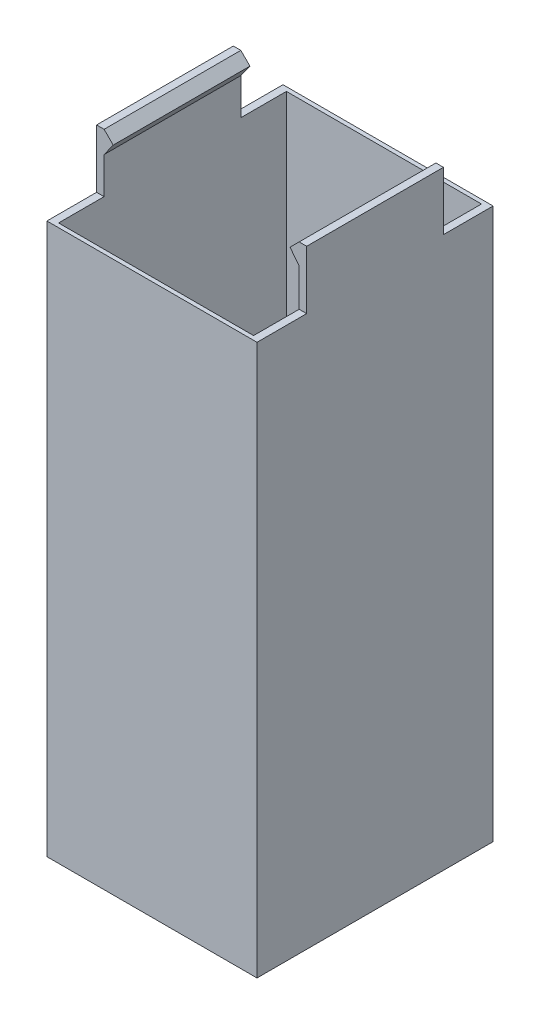
ISO-10303-21;
HEADER;
FILE_DESCRIPTION(('STEP AP214'),'2;1');
FILE_NAME('part.step','',(''),(''),'','','');
FILE_SCHEMA(('AUTOMOTIVE_DESIGN { 1 0 10303 214 1 1 1 1 }'));
ENDSEC;
DATA;
#1=APPLICATION_CONTEXT('core data for automotive mechanical design processes');
#2=APPLICATION_PROTOCOL_DEFINITION('international standard','automotive_design',2000,#1);
#3=PRODUCT_CONTEXT('',#1,'mechanical');
#4=PRODUCT('Part','Part','',(#3));
#5=PRODUCT_RELATED_PRODUCT_CATEGORY('part','',(#4));
#6=PRODUCT_DEFINITION_FORMATION('','',#4);
#7=PRODUCT_DEFINITION_CONTEXT('part definition',#1,'design');
#8=PRODUCT_DEFINITION('design','',#6,#7);
#9=PRODUCT_DEFINITION_SHAPE('','',#8);
#10=(LENGTH_UNIT() NAMED_UNIT(*) SI_UNIT(.MILLI.,.METRE.));
#11=(NAMED_UNIT(*) PLANE_ANGLE_UNIT() SI_UNIT($,.RADIAN.));
#12=(NAMED_UNIT(*) SI_UNIT($,.STERADIAN.) SOLID_ANGLE_UNIT());
#13=UNCERTAINTY_MEASURE_WITH_UNIT(LENGTH_MEASURE(1.E-05),#10,'distance_accuracy_value','');
#14=(GEOMETRIC_REPRESENTATION_CONTEXT(3) GLOBAL_UNCERTAINTY_ASSIGNED_CONTEXT((#13)) GLOBAL_UNIT_ASSIGNED_CONTEXT((#10,
#11,#12)) REPRESENTATION_CONTEXT('',''));
#15=CARTESIAN_POINT('',(0.,0.,0.));
#16=DIRECTION('',(0.,0.,1.));
#17=DIRECTION('',(1.,0.,0.));
#18=AXIS2_PLACEMENT_3D('',#15,#16,#17);
#19=CARTESIAN_POINT('',(0.,120.,0.));
#20=DIRECTION('',(0.,1.,0.));
#21=DIRECTION('',(0.,0.,1.));
#22=AXIS2_PLACEMENT_3D('',#19,#20,#21);
#23=PLANE('',#22);
#24=DIRECTION('',(0.,0.,-1.));
#25=VECTOR('',#24,1.);
#26=CARTESIAN_POINT('',(23.05,120.,-25.9));
#27=LINE('',#26,#25);
#28=CARTESIAN_POINT('',(23.05,120.,25.9));
#29=VERTEX_POINT('',#28);
#30=CARTESIAN_POINT('',(23.05,120.,15.));
#31=VERTEX_POINT('',#30);
#32=EDGE_CURVE('E183',#29,#31,#27,.T.);
#33=ORIENTED_EDGE('',*,*,#32,.T.);
#34=DIRECTION('',(1.,0.,0.));
#35=VECTOR('',#34,1.);
#36=CARTESIAN_POINT('',(21.4,120.,15.));
#37=LINE('',#36,#35);
#38=CARTESIAN_POINT('',(21.4,120.,15.));
#39=VERTEX_POINT('',#38);
#40=EDGE_CURVE('E226',#39,#31,#37,.T.);
#41=ORIENTED_EDGE('',*,*,#40,.F.);
#42=DIRECTION('',(0.,0.,-1.));
#43=VECTOR('',#42,1.);
#44=CARTESIAN_POINT('',(21.4,120.,-25.));
#45=LINE('',#44,#43);
#46=CARTESIAN_POINT('',(21.4,120.,25.));
#47=VERTEX_POINT('',#46);
#48=EDGE_CURVE('E289',#47,#39,#45,.T.);
#49=ORIENTED_EDGE('',*,*,#48,.F.);
#50=DIRECTION('',(1.,0.,0.));
#51=VECTOR('',#50,1.);
#52=CARTESIAN_POINT('',(21.4,120.,25.));
#53=LINE('',#52,#51);
#54=CARTESIAN_POINT('',(-21.4,120.,25.));
#55=VERTEX_POINT('',#54);
#56=EDGE_CURVE('E285',#55,#47,#53,.T.);
#57=ORIENTED_EDGE('',*,*,#56,.F.);
#58=DIRECTION('',(0.,0.,1.));
#59=VECTOR('',#58,1.);
#60=CARTESIAN_POINT('',(-21.4,120.,-25.));
#61=LINE('',#60,#59);
#62=CARTESIAN_POINT('',(-21.4,120.,15.));
#63=VERTEX_POINT('',#62);
#64=EDGE_CURVE('E286',#63,#55,#61,.T.);
#65=ORIENTED_EDGE('',*,*,#64,.F.);
#66=DIRECTION('',(1.,0.,0.));
#67=VECTOR('',#66,1.);
#68=CARTESIAN_POINT('',(-21.4,120.,15.));
#69=LINE('',#68,#67);
#70=CARTESIAN_POINT('',(-23.05,120.,15.));
#71=VERTEX_POINT('',#70);
#72=EDGE_CURVE('E256',#71,#63,#69,.T.);
#73=ORIENTED_EDGE('',*,*,#72,.F.);
#74=DIRECTION('',(0.,0.,1.));
#75=VECTOR('',#74,1.);
#76=CARTESIAN_POINT('',(-23.05,120.,-25.9));
#77=LINE('',#76,#75);
#78=CARTESIAN_POINT('',(-23.05,120.,25.9));
#79=VERTEX_POINT('',#78);
#80=EDGE_CURVE('E318',#71,#79,#77,.T.);
#81=ORIENTED_EDGE('',*,*,#80,.T.);
#82=DIRECTION('',(1.,0.,0.));
#83=VECTOR('',#82,1.);
#84=CARTESIAN_POINT('',(-23.05,120.,25.9));
#85=LINE('',#84,#83);
#86=EDGE_CURVE('E187',#79,#29,#85,.T.);
#87=ORIENTED_EDGE('',*,*,#86,.T.);
#88=EDGE_LOOP('',(#33,#41,#49,#57,#65,#73,#81,#87));
#89=FACE_BOUND('',#88,.T.);
#90=ADVANCED_FACE('F37',(#89),#23,.T.);
#91=CARTESIAN_POINT('',(21.4,120.,-15.));
#92=VERTEX_POINT('',#91);
#93=CARTESIAN_POINT('',(21.4,120.,-25.));
#94=VERTEX_POINT('',#93);
#95=EDGE_CURVE('E288',#92,#94,#45,.T.);
#96=ORIENTED_EDGE('',*,*,#95,.F.);
#97=DIRECTION('',(-1.,0.,0.));
#98=VECTOR('',#97,1.);
#99=CARTESIAN_POINT('',(21.4,120.,-15.));
#100=LINE('',#99,#98);
#101=CARTESIAN_POINT('',(23.05,120.,-15.));
#102=VERTEX_POINT('',#101);
#103=EDGE_CURVE('E240',#102,#92,#100,.T.);
#104=ORIENTED_EDGE('',*,*,#103,.F.);
#105=CARTESIAN_POINT('',(23.05,120.,-25.9));
#106=VERTEX_POINT('',#105);
#107=EDGE_CURVE('E314',#102,#106,#27,.T.);
#108=ORIENTED_EDGE('',*,*,#107,.T.);
#109=DIRECTION('',(-1.,0.,0.));
#110=VECTOR('',#109,1.);
#111=CARTESIAN_POINT('',(-23.05,120.,-25.9));
#112=LINE('',#111,#110);
#113=CARTESIAN_POINT('',(-23.05,120.,-25.9));
#114=VERTEX_POINT('',#113);
#115=EDGE_CURVE('E316',#106,#114,#112,.T.);
#116=ORIENTED_EDGE('',*,*,#115,.T.);
#117=CARTESIAN_POINT('',(-23.05,120.,-15.));
#118=VERTEX_POINT('',#117);
#119=EDGE_CURVE('E319',#114,#118,#77,.T.);
#120=ORIENTED_EDGE('',*,*,#119,.T.);
#121=DIRECTION('',(-1.,0.,0.));
#122=VECTOR('',#121,1.);
#123=CARTESIAN_POINT('',(-21.4,120.,-15.));
#124=LINE('',#123,#122);
#125=CARTESIAN_POINT('',(-21.4,120.,-15.));
#126=VERTEX_POINT('',#125);
#127=EDGE_CURVE('E261',#126,#118,#124,.T.);
#128=ORIENTED_EDGE('',*,*,#127,.F.);
#129=CARTESIAN_POINT('',(-21.4,120.,-25.));
#130=VERTEX_POINT('',#129);
#131=EDGE_CURVE('E282',#130,#126,#61,.T.);
#132=ORIENTED_EDGE('',*,*,#131,.F.);
#133=DIRECTION('',(-1.,0.,0.));
#134=VECTOR('',#133,1.);
#135=CARTESIAN_POINT('',(21.4,120.,-25.));
#136=LINE('',#135,#134);
#137=EDGE_CURVE('E292',#94,#130,#136,.T.);
#138=ORIENTED_EDGE('',*,*,#137,.F.);
#139=EDGE_LOOP('',(#96,#104,#108,#116,#120,#128,#132,#138));
#140=FACE_BOUND('',#139,.T.);
#141=ADVANCED_FACE('F336',(#140),#23,.T.);
#142=CARTESIAN_POINT('',(23.05,120.,-25.9));
#143=DIRECTION('',(-1.,0.,0.));
#144=DIRECTION('',(0.,0.,1.));
#145=AXIS2_PLACEMENT_3D('',#142,#143,#144);
#146=PLANE('',#145);
#147=DIRECTION('',(0.,-1.,0.));
#148=VECTOR('',#147,1.);
#149=CARTESIAN_POINT('',(23.05,120.,25.9));
#150=LINE('',#149,#148);
#151=CARTESIAN_POINT('',(23.05,-0.8,25.9));
#152=VERTEX_POINT('',#151);
#153=EDGE_CURVE('E176',#29,#152,#150,.T.);
#154=ORIENTED_EDGE('',*,*,#153,.T.);
#155=DIRECTION('',(0.,0.,1.));
#156=VECTOR('',#155,1.);
#157=CARTESIAN_POINT('',(23.05,-0.8,25.9));
#158=LINE('',#157,#156);
#159=CARTESIAN_POINT('',(23.05,-0.8,-25.9));
#160=VERTEX_POINT('',#159);
#161=EDGE_CURVE('E180',#160,#152,#158,.T.);
#162=ORIENTED_EDGE('',*,*,#161,.F.);
#163=DIRECTION('',(0.,-1.,0.));
#164=VECTOR('',#163,1.);
#165=CARTESIAN_POINT('',(23.05,120.,-25.9));
#166=LINE('',#165,#164);
#167=EDGE_CURVE('E11',#106,#160,#166,.T.);
#168=ORIENTED_EDGE('',*,*,#167,.F.);
#169=ORIENTED_EDGE('',*,*,#107,.F.);
#170=DIRECTION('',(0.,-1.,0.));
#171=VECTOR('',#170,1.);
#172=CARTESIAN_POINT('',(23.05,132.8,-15.));
#173=LINE('',#172,#171);
#174=CARTESIAN_POINT('',(23.05,132.8,-15.));
#175=VERTEX_POINT('',#174);
#176=EDGE_CURVE('E250',#175,#102,#173,.T.);
#177=ORIENTED_EDGE('',*,*,#176,.F.);
#178=DIRECTION('',(0.,0.,-1.));
#179=VECTOR('',#178,1.);
#180=CARTESIAN_POINT('',(23.05,132.8,15.));
#181=LINE('',#180,#179);
#182=CARTESIAN_POINT('',(23.05,132.8,15.));
#183=VERTEX_POINT('',#182);
#184=EDGE_CURVE('E242',#183,#175,#181,.T.);
#185=ORIENTED_EDGE('',*,*,#184,.F.);
#186=DIRECTION('',(0.,-1.,0.));
#187=VECTOR('',#186,1.);
#188=CARTESIAN_POINT('',(23.05,132.8,15.));
#189=LINE('',#188,#187);
#190=EDGE_CURVE('E252',#183,#31,#189,.T.);
#191=ORIENTED_EDGE('',*,*,#190,.T.);
#192=ORIENTED_EDGE('',*,*,#32,.F.);
#193=EDGE_LOOP('',(#154,#162,#168,#169,#177,#185,#191,#192));
#194=FACE_BOUND('',#193,.T.);
#195=ADVANCED_FACE('F39',(#194),#146,.F.);
#196=CARTESIAN_POINT('',(-23.05,120.,-25.9));
#197=DIRECTION('',(0.,0.,1.));
#198=DIRECTION('',(1.,0.,0.));
#199=AXIS2_PLACEMENT_3D('',#196,#197,#198);
#200=PLANE('',#199);
#201=ORIENTED_EDGE('',*,*,#167,.T.);
#202=DIRECTION('',(1.,0.,0.));
#203=VECTOR('',#202,1.);
#204=CARTESIAN_POINT('',(23.05,-0.8,-25.9));
#205=LINE('',#204,#203);
#206=CARTESIAN_POINT('',(-23.05,-0.8,-25.9));
#207=VERTEX_POINT('',#206);
#208=EDGE_CURVE('E201',#207,#160,#205,.T.);
#209=ORIENTED_EDGE('',*,*,#208,.F.);
#210=DIRECTION('',(0.,-1.,0.));
#211=VECTOR('',#210,1.);
#212=CARTESIAN_POINT('',(-23.05,120.,-25.9));
#213=LINE('',#212,#211);
#214=EDGE_CURVE('E45',#114,#207,#213,.T.);
#215=ORIENTED_EDGE('',*,*,#214,.F.);
#216=ORIENTED_EDGE('',*,*,#115,.F.);
#217=EDGE_LOOP('',(#201,#209,#215,#216));
#218=FACE_BOUND('',#217,.T.);
#219=ADVANCED_FACE('F328',(#218),#200,.F.);
#220=CARTESIAN_POINT('',(-23.05,120.,-25.9));
#221=DIRECTION('',(1.,0.,0.));
#222=DIRECTION('',(0.,0.,-1.));
#223=AXIS2_PLACEMENT_3D('',#220,#221,#222);
#224=PLANE('',#223);
#225=ORIENTED_EDGE('',*,*,#214,.T.);
#226=DIRECTION('',(0.,0.,-1.));
#227=VECTOR('',#226,1.);
#228=CARTESIAN_POINT('',(-23.05,-0.8,25.9));
#229=LINE('',#228,#227);
#230=CARTESIAN_POINT('',(-23.05,-0.8,25.9));
#231=VERTEX_POINT('',#230);
#232=EDGE_CURVE('E196',#231,#207,#229,.T.);
#233=ORIENTED_EDGE('',*,*,#232,.F.);
#234=DIRECTION('',(0.,-1.,0.));
#235=VECTOR('',#234,1.);
#236=CARTESIAN_POINT('',(-23.05,120.,25.9));
#237=LINE('',#236,#235);
#238=EDGE_CURVE('E186',#79,#231,#237,.T.);
#239=ORIENTED_EDGE('',*,*,#238,.F.);
#240=ORIENTED_EDGE('',*,*,#80,.F.);
#241=DIRECTION('',(0.,-1.,0.));
#242=VECTOR('',#241,1.);
#243=CARTESIAN_POINT('',(-23.05,132.8,15.));
#244=LINE('',#243,#242);
#245=CARTESIAN_POINT('',(-23.05,132.8,15.));
#246=VERTEX_POINT('',#245);
#247=EDGE_CURVE('E278',#246,#71,#244,.T.);
#248=ORIENTED_EDGE('',*,*,#247,.F.);
#249=DIRECTION('',(0.,0.,1.));
#250=VECTOR('',#249,1.);
#251=CARTESIAN_POINT('',(-23.05,132.8,15.));
#252=LINE('',#251,#250);
#253=CARTESIAN_POINT('',(-23.05,132.8,-15.));
#254=VERTEX_POINT('',#253);
#255=EDGE_CURVE('E257',#254,#246,#252,.T.);
#256=ORIENTED_EDGE('',*,*,#255,.F.);
#257=DIRECTION('',(0.,-1.,0.));
#258=VECTOR('',#257,1.);
#259=CARTESIAN_POINT('',(-23.05,132.8,-15.));
#260=LINE('',#259,#258);
#261=EDGE_CURVE('E269',#254,#118,#260,.T.);
#262=ORIENTED_EDGE('',*,*,#261,.T.);
#263=ORIENTED_EDGE('',*,*,#119,.F.);
#264=EDGE_LOOP('',(#225,#233,#239,#240,#248,#256,#262,#263));
#265=FACE_BOUND('',#264,.T.);
#266=ADVANCED_FACE('F325',(#265),#224,.F.);
#267=CARTESIAN_POINT('',(-23.05,120.,25.9));
#268=DIRECTION('',(0.,0.,-1.));
#269=DIRECTION('',(-1.,0.,0.));
#270=AXIS2_PLACEMENT_3D('',#267,#268,#269);
#271=PLANE('',#270);
#272=ORIENTED_EDGE('',*,*,#238,.T.);
#273=DIRECTION('',(-1.,0.,0.));
#274=VECTOR('',#273,1.);
#275=CARTESIAN_POINT('',(23.05,-0.8,25.9));
#276=LINE('',#275,#274);
#277=EDGE_CURVE('E190',#152,#231,#276,.T.);
#278=ORIENTED_EDGE('',*,*,#277,.F.);
#279=ORIENTED_EDGE('',*,*,#153,.F.);
#280=ORIENTED_EDGE('',*,*,#86,.F.);
#281=EDGE_LOOP('',(#272,#278,#279,#280));
#282=FACE_BOUND('',#281,.T.);
#283=ADVANCED_FACE('F191',(#282),#271,.F.);
#284=CARTESIAN_POINT('',(-21.4,120.,-25.));
#285=DIRECTION('',(1.,0.,0.));
#286=DIRECTION('',(0.,0.,-1.));
#287=AXIS2_PLACEMENT_3D('',#284,#285,#286);
#288=PLANE('',#287);
#289=DIRECTION('',(0.,0.,1.));
#290=VECTOR('',#289,1.);
#291=CARTESIAN_POINT('',(-21.4,128.,-20.2));
#292=LINE('',#291,#290);
#293=CARTESIAN_POINT('',(-21.4,128.,-15.));
#294=VERTEX_POINT('',#293);
#295=CARTESIAN_POINT('',(-21.4,128.,15.));
#296=VERTEX_POINT('',#295);
#297=EDGE_CURVE('E232',#294,#296,#292,.T.);
#298=ORIENTED_EDGE('',*,*,#297,.T.);
#299=DIRECTION('',(0.,-1.,0.));
#300=VECTOR('',#299,1.);
#301=CARTESIAN_POINT('',(-21.4,132.8,15.));
#302=LINE('',#301,#300);
#303=EDGE_CURVE('E276',#296,#63,#302,.T.);
#304=ORIENTED_EDGE('',*,*,#303,.T.);
#305=ORIENTED_EDGE('',*,*,#64,.T.);
#306=DIRECTION('',(0.,-1.,0.));
#307=VECTOR('',#306,1.);
#308=CARTESIAN_POINT('',(-21.4,120.,25.));
#309=LINE('',#308,#307);
#310=CARTESIAN_POINT('',(-21.4,0.,25.));
#311=VERTEX_POINT('',#310);
#312=EDGE_CURVE('E311',#55,#311,#309,.T.);
#313=ORIENTED_EDGE('',*,*,#312,.T.);
#314=DIRECTION('',(0.,0.,1.));
#315=VECTOR('',#314,1.);
#316=CARTESIAN_POINT('',(-21.4,0.,-25.));
#317=LINE('',#316,#315);
#318=CARTESIAN_POINT('',(-21.4,0.,-25.));
#319=VERTEX_POINT('',#318);
#320=EDGE_CURVE('E281',#319,#311,#317,.T.);
#321=ORIENTED_EDGE('',*,*,#320,.F.);
#322=DIRECTION('',(0.,-1.,0.));
#323=VECTOR('',#322,1.);
#324=CARTESIAN_POINT('',(-21.4,120.,-25.));
#325=LINE('',#324,#323);
#326=EDGE_CURVE('E294',#130,#319,#325,.T.);
#327=ORIENTED_EDGE('',*,*,#326,.F.);
#328=ORIENTED_EDGE('',*,*,#131,.T.);
#329=DIRECTION('',(0.,-1.,0.));
#330=VECTOR('',#329,1.);
#331=CARTESIAN_POINT('',(-21.4,132.8,-15.));
#332=LINE('',#331,#330);
#333=EDGE_CURVE('E60',#294,#126,#332,.T.);
#334=ORIENTED_EDGE('',*,*,#333,.F.);
#335=EDGE_LOOP('',(#298,#304,#305,#313,#321,#327,#328,#334));
#336=FACE_BOUND('',#335,.T.);
#337=ADVANCED_FACE('F366',(#336),#288,.T.);
#338=CARTESIAN_POINT('',(21.4,120.,25.));
#339=DIRECTION('',(0.,0.,-1.));
#340=DIRECTION('',(-1.,0.,0.));
#341=AXIS2_PLACEMENT_3D('',#338,#339,#340);
#342=PLANE('',#341);
#343=DIRECTION('',(1.,0.,0.));
#344=VECTOR('',#343,1.);
#345=CARTESIAN_POINT('',(21.4,0.,25.));
#346=LINE('',#345,#344);
#347=CARTESIAN_POINT('',(21.4,0.,25.));
#348=VERTEX_POINT('',#347);
#349=EDGE_CURVE('E297',#311,#348,#346,.T.);
#350=ORIENTED_EDGE('',*,*,#349,.F.);
#351=ORIENTED_EDGE('',*,*,#312,.F.);
#352=ORIENTED_EDGE('',*,*,#56,.T.);
#353=DIRECTION('',(0.,-1.,0.));
#354=VECTOR('',#353,1.);
#355=CARTESIAN_POINT('',(21.4,120.,25.));
#356=LINE('',#355,#354);
#357=EDGE_CURVE('E309',#47,#348,#356,.T.);
#358=ORIENTED_EDGE('',*,*,#357,.T.);
#359=EDGE_LOOP('',(#350,#351,#352,#358));
#360=FACE_BOUND('',#359,.T.);
#361=ADVANCED_FACE('F379',(#360),#342,.T.);
#362=CARTESIAN_POINT('',(21.4,120.,-25.));
#363=DIRECTION('',(-1.,0.,0.));
#364=DIRECTION('',(0.,0.,1.));
#365=AXIS2_PLACEMENT_3D('',#362,#363,#364);
#366=PLANE('',#365);
#367=DIRECTION('',(0.,0.,1.));
#368=VECTOR('',#367,1.);
#369=CARTESIAN_POINT('',(21.4,128.2,-20.2));
#370=LINE('',#369,#368);
#371=CARTESIAN_POINT('',(21.4,128.2,-15.));
#372=VERTEX_POINT('',#371);
#373=CARTESIAN_POINT('',(21.4,128.2,15.));
#374=VERTEX_POINT('',#373);
#375=EDGE_CURVE('E210',#372,#374,#370,.T.);
#376=ORIENTED_EDGE('',*,*,#375,.F.);
#377=DIRECTION('',(0.,-1.,0.));
#378=VECTOR('',#377,1.);
#379=CARTESIAN_POINT('',(21.4,132.8,-15.));
#380=LINE('',#379,#378);
#381=EDGE_CURVE('E52',#372,#92,#380,.T.);
#382=ORIENTED_EDGE('',*,*,#381,.T.);
#383=ORIENTED_EDGE('',*,*,#95,.T.);
#384=DIRECTION('',(0.,-1.,0.));
#385=VECTOR('',#384,1.);
#386=CARTESIAN_POINT('',(21.4,120.,-25.));
#387=LINE('',#386,#385);
#388=CARTESIAN_POINT('',(21.4,0.,-25.));
#389=VERTEX_POINT('',#388);
#390=EDGE_CURVE('E307',#94,#389,#387,.T.);
#391=ORIENTED_EDGE('',*,*,#390,.T.);
#392=DIRECTION('',(0.,0.,-1.));
#393=VECTOR('',#392,1.);
#394=CARTESIAN_POINT('',(21.4,0.,-25.));
#395=LINE('',#394,#393);
#396=EDGE_CURVE('E300',#348,#389,#395,.T.);
#397=ORIENTED_EDGE('',*,*,#396,.F.);
#398=ORIENTED_EDGE('',*,*,#357,.F.);
#399=ORIENTED_EDGE('',*,*,#48,.T.);
#400=DIRECTION('',(0.,-1.,0.));
#401=VECTOR('',#400,1.);
#402=CARTESIAN_POINT('',(21.4,132.8,15.));
#403=LINE('',#402,#401);
#404=EDGE_CURVE('E254',#374,#39,#403,.T.);
#405=ORIENTED_EDGE('',*,*,#404,.F.);
#406=EDGE_LOOP('',(#376,#382,#383,#391,#397,#398,#399,#405));
#407=FACE_BOUND('',#406,.T.);
#408=ADVANCED_FACE('F373',(#407),#366,.T.);
#409=CARTESIAN_POINT('',(21.4,120.,-25.));
#410=DIRECTION('',(0.,0.,1.));
#411=DIRECTION('',(1.,0.,0.));
#412=AXIS2_PLACEMENT_3D('',#409,#410,#411);
#413=PLANE('',#412);
#414=DIRECTION('',(-1.,0.,0.));
#415=VECTOR('',#414,1.);
#416=CARTESIAN_POINT('',(21.4,0.,-25.));
#417=LINE('',#416,#415);
#418=EDGE_CURVE('E303',#389,#319,#417,.T.);
#419=ORIENTED_EDGE('',*,*,#418,.F.);
#420=ORIENTED_EDGE('',*,*,#390,.F.);
#421=ORIENTED_EDGE('',*,*,#137,.T.);
#422=ORIENTED_EDGE('',*,*,#326,.T.);
#423=EDGE_LOOP('',(#419,#420,#421,#422));
#424=FACE_BOUND('',#423,.T.);
#425=ADVANCED_FACE('F370',(#424),#413,.T.);
#426=CARTESIAN_POINT('',(-21.4,132.8,15.));
#427=DIRECTION('',(0.,0.,-1.));
#428=DIRECTION('',(-1.,0.,0.));
#429=AXIS2_PLACEMENT_3D('',#426,#427,#428);
#430=PLANE('',#429);
#431=ORIENTED_EDGE('',*,*,#72,.T.);
#432=ORIENTED_EDGE('',*,*,#303,.F.);
#433=DIRECTION('',(0.581238193719097,0.813733471206735,0.));
#434=VECTOR('',#433,1.);
#435=CARTESIAN_POINT('',(-19.4,130.8,15.));
#436=LINE('',#435,#434);
#437=CARTESIAN_POINT('',(-19.4,130.8,15.));
#438=VERTEX_POINT('',#437);
#439=EDGE_CURVE('E229',#296,#438,#436,.T.);
#440=ORIENTED_EDGE('',*,*,#439,.T.);
#441=DIRECTION('',(-0.707106781186547,0.707106781186548,0.));
#442=VECTOR('',#441,1.);
#443=CARTESIAN_POINT('',(-21.4,132.8,15.));
#444=LINE('',#443,#442);
#445=CARTESIAN_POINT('',(-21.4,132.8,15.));
#446=VERTEX_POINT('',#445);
#447=EDGE_CURVE('E220',#438,#446,#444,.T.);
#448=ORIENTED_EDGE('',*,*,#447,.T.);
#449=DIRECTION('',(1.,0.,0.));
#450=VECTOR('',#449,1.);
#451=CARTESIAN_POINT('',(-21.4,132.8,15.));
#452=LINE('',#451,#450);
#453=EDGE_CURVE('E260',#246,#446,#452,.T.);
#454=ORIENTED_EDGE('',*,*,#453,.F.);
#455=ORIENTED_EDGE('',*,*,#247,.T.);
#456=EDGE_LOOP('',(#431,#432,#440,#448,#454,#455));
#457=FACE_BOUND('',#456,.T.);
#458=ADVANCED_FACE('F355',(#457),#430,.F.);
#459=CARTESIAN_POINT('',(-21.4,132.8,-15.));
#460=DIRECTION('',(0.,0.,1.));
#461=DIRECTION('',(1.,0.,0.));
#462=AXIS2_PLACEMENT_3D('',#459,#460,#461);
#463=PLANE('',#462);
#464=ORIENTED_EDGE('',*,*,#127,.T.);
#465=ORIENTED_EDGE('',*,*,#261,.F.);
#466=DIRECTION('',(-1.,0.,0.));
#467=VECTOR('',#466,1.);
#468=CARTESIAN_POINT('',(-21.4,132.8,-15.));
#469=LINE('',#468,#467);
#470=CARTESIAN_POINT('',(-21.4,132.8,-15.));
#471=VERTEX_POINT('',#470);
#472=EDGE_CURVE('E267',#471,#254,#469,.T.);
#473=ORIENTED_EDGE('',*,*,#472,.F.);
#474=DIRECTION('',(0.707106781186547,-0.707106781186548,0.));
#475=VECTOR('',#474,1.);
#476=CARTESIAN_POINT('',(-21.4,132.8,-15.));
#477=LINE('',#476,#475);
#478=CARTESIAN_POINT('',(-19.4,130.8,-15.));
#479=VERTEX_POINT('',#478);
#480=EDGE_CURVE('E223',#471,#479,#477,.T.);
#481=ORIENTED_EDGE('',*,*,#480,.T.);
#482=DIRECTION('',(-0.581238193719097,-0.813733471206735,0.));
#483=VECTOR('',#482,1.);
#484=CARTESIAN_POINT('',(-19.4,130.8,-15.));
#485=LINE('',#484,#483);
#486=EDGE_CURVE('E221',#479,#294,#485,.T.);
#487=ORIENTED_EDGE('',*,*,#486,.T.);
#488=ORIENTED_EDGE('',*,*,#333,.T.);
#489=EDGE_LOOP('',(#464,#465,#473,#481,#487,#488));
#490=FACE_BOUND('',#489,.T.);
#491=ADVANCED_FACE('F362',(#490),#463,.F.);
#492=CARTESIAN_POINT('',(0.,132.8,0.));
#493=DIRECTION('',(0.,1.,0.));
#494=DIRECTION('',(0.,0.,1.));
#495=AXIS2_PLACEMENT_3D('',#492,#493,#494);
#496=PLANE('',#495);
#497=ORIENTED_EDGE('',*,*,#255,.T.);
#498=ORIENTED_EDGE('',*,*,#453,.T.);
#499=DIRECTION('',(0.,0.,-1.));
#500=VECTOR('',#499,1.);
#501=CARTESIAN_POINT('',(-21.4,132.8,15.));
#502=LINE('',#501,#500);
#503=EDGE_CURVE('E264',#446,#471,#502,.T.);
#504=ORIENTED_EDGE('',*,*,#503,.T.);
#505=ORIENTED_EDGE('',*,*,#472,.T.);
#506=EDGE_LOOP('',(#497,#498,#504,#505));
#507=FACE_BOUND('',#506,.T.);
#508=ADVANCED_FACE('F359',(#507),#496,.T.);
#509=CARTESIAN_POINT('',(21.4,132.8,15.));
#510=DIRECTION('',(0.,0.,-1.));
#511=DIRECTION('',(-1.,0.,0.));
#512=AXIS2_PLACEMENT_3D('',#509,#510,#511);
#513=PLANE('',#512);
#514=ORIENTED_EDGE('',*,*,#40,.T.);
#515=ORIENTED_EDGE('',*,*,#190,.F.);
#516=DIRECTION('',(1.,0.,0.));
#517=VECTOR('',#516,1.);
#518=CARTESIAN_POINT('',(21.4,132.8,15.));
#519=LINE('',#518,#517);
#520=CARTESIAN_POINT('',(21.4,132.8,15.));
#521=VERTEX_POINT('',#520);
#522=EDGE_CURVE('E239',#521,#183,#519,.T.);
#523=ORIENTED_EDGE('',*,*,#522,.F.);
#524=DIRECTION('',(-0.707106781186548,-0.707106781186547,0.));
#525=VECTOR('',#524,1.);
#526=CARTESIAN_POINT('',(21.4,132.8,15.));
#527=LINE('',#526,#525);
#528=CARTESIAN_POINT('',(19.4,130.8,15.));
#529=VERTEX_POINT('',#528);
#530=EDGE_CURVE('E206',#521,#529,#527,.T.);
#531=ORIENTED_EDGE('',*,*,#530,.T.);
#532=DIRECTION('',(0.609710760849694,-0.792623989104599,0.));
#533=VECTOR('',#532,1.);
#534=CARTESIAN_POINT('',(19.4,130.8,15.));
#535=LINE('',#534,#533);
#536=EDGE_CURVE('E213',#529,#374,#535,.T.);
#537=ORIENTED_EDGE('',*,*,#536,.T.);
#538=ORIENTED_EDGE('',*,*,#404,.T.);
#539=EDGE_LOOP('',(#514,#515,#523,#531,#537,#538));
#540=FACE_BOUND('',#539,.T.);
#541=ADVANCED_FACE('F382',(#540),#513,.F.);
#542=CARTESIAN_POINT('',(21.4,132.8,-15.));
#543=DIRECTION('',(0.,0.,1.));
#544=DIRECTION('',(1.,0.,0.));
#545=AXIS2_PLACEMENT_3D('',#542,#543,#544);
#546=PLANE('',#545);
#547=ORIENTED_EDGE('',*,*,#103,.T.);
#548=ORIENTED_EDGE('',*,*,#381,.F.);
#549=DIRECTION('',(-0.609710760849694,0.792623989104599,0.));
#550=VECTOR('',#549,1.);
#551=CARTESIAN_POINT('',(19.4,130.8,-15.));
#552=LINE('',#551,#550);
#553=CARTESIAN_POINT('',(19.4,130.8,-15.));
#554=VERTEX_POINT('',#553);
#555=EDGE_CURVE('E209',#372,#554,#552,.T.);
#556=ORIENTED_EDGE('',*,*,#555,.T.);
#557=DIRECTION('',(0.707106781186548,0.707106781186547,0.));
#558=VECTOR('',#557,1.);
#559=CARTESIAN_POINT('',(21.4,132.8,-15.));
#560=LINE('',#559,#558);
#561=CARTESIAN_POINT('',(21.4,132.8,-15.));
#562=VERTEX_POINT('',#561);
#563=EDGE_CURVE('E207',#554,#562,#560,.T.);
#564=ORIENTED_EDGE('',*,*,#563,.T.);
#565=DIRECTION('',(-1.,0.,0.));
#566=VECTOR('',#565,1.);
#567=CARTESIAN_POINT('',(21.4,132.8,-15.));
#568=LINE('',#567,#566);
#569=EDGE_CURVE('E244',#175,#562,#568,.T.);
#570=ORIENTED_EDGE('',*,*,#569,.F.);
#571=ORIENTED_EDGE('',*,*,#176,.T.);
#572=EDGE_LOOP('',(#547,#548,#556,#564,#570,#571));
#573=FACE_BOUND('',#572,.T.);
#574=ADVANCED_FACE('F339',(#573),#546,.F.);
#575=CARTESIAN_POINT('',(0.,132.8,0.));
#576=DIRECTION('',(0.,-1.,0.));
#577=DIRECTION('',(0.,0.,-1.));
#578=AXIS2_PLACEMENT_3D('',#575,#576,#577);
#579=PLANE('',#578);
#580=DIRECTION('',(0.,0.,1.));
#581=VECTOR('',#580,1.);
#582=CARTESIAN_POINT('',(21.4,132.8,15.));
#583=LINE('',#582,#581);
#584=EDGE_CURVE('E236',#562,#521,#583,.T.);
#585=ORIENTED_EDGE('',*,*,#584,.T.);
#586=ORIENTED_EDGE('',*,*,#522,.T.);
#587=ORIENTED_EDGE('',*,*,#184,.T.);
#588=ORIENTED_EDGE('',*,*,#569,.T.);
#589=EDGE_LOOP('',(#585,#586,#587,#588));
#590=FACE_BOUND('',#589,.T.);
#591=ADVANCED_FACE('F343',(#590),#579,.F.);
#592=CARTESIAN_POINT('',(-21.4,132.8,-20.2));
#593=DIRECTION('',(0.707106781186548,0.707106781186547,0.));
#594=DIRECTION('',(-0.707106781186547,0.707106781186548,0.));
#595=AXIS2_PLACEMENT_3D('',#592,#593,#594);
#596=PLANE('',#595);
#597=ORIENTED_EDGE('',*,*,#480,.F.);
#598=ORIENTED_EDGE('',*,*,#503,.F.);
#599=ORIENTED_EDGE('',*,*,#447,.F.);
#600=DIRECTION('',(0.,0.,1.));
#601=VECTOR('',#600,1.);
#602=CARTESIAN_POINT('',(-19.4,130.8,-20.2));
#603=LINE('',#602,#601);
#604=EDGE_CURVE('E224',#479,#438,#603,.T.);
#605=ORIENTED_EDGE('',*,*,#604,.F.);
#606=EDGE_LOOP('',(#597,#598,#599,#605));
#607=FACE_BOUND('',#606,.T.);
#608=ADVANCED_FACE('F397',(#607),#596,.T.);
#609=CARTESIAN_POINT('',(-19.4,130.8,-20.2));
#610=DIRECTION('',(0.813733471206735,-0.581238193719097,0.));
#611=DIRECTION('',(0.581238193719097,0.813733471206735,0.));
#612=AXIS2_PLACEMENT_3D('',#609,#610,#611);
#613=PLANE('',#612);
#614=ORIENTED_EDGE('',*,*,#486,.F.);
#615=ORIENTED_EDGE('',*,*,#604,.T.);
#616=ORIENTED_EDGE('',*,*,#439,.F.);
#617=ORIENTED_EDGE('',*,*,#297,.F.);
#618=EDGE_LOOP('',(#614,#615,#616,#617));
#619=FACE_BOUND('',#618,.T.);
#620=ADVANCED_FACE('F390',(#619),#613,.T.);
#621=CARTESIAN_POINT('',(21.4,132.8,-20.2));
#622=DIRECTION('',(-0.707106781186547,0.707106781186548,0.));
#623=DIRECTION('',(-0.707106781186548,-0.707106781186547,0.));
#624=AXIS2_PLACEMENT_3D('',#621,#622,#623);
#625=PLANE('',#624);
#626=ORIENTED_EDGE('',*,*,#563,.F.);
#627=DIRECTION('',(0.,0.,1.));
#628=VECTOR('',#627,1.);
#629=CARTESIAN_POINT('',(19.4,130.8,-20.2));
#630=LINE('',#629,#628);
#631=EDGE_CURVE('E216',#554,#529,#630,.T.);
#632=ORIENTED_EDGE('',*,*,#631,.T.);
#633=ORIENTED_EDGE('',*,*,#530,.F.);
#634=ORIENTED_EDGE('',*,*,#584,.F.);
#635=EDGE_LOOP('',(#626,#632,#633,#634));
#636=FACE_BOUND('',#635,.T.);
#637=ADVANCED_FACE('F388',(#636),#625,.T.);
#638=CARTESIAN_POINT('',(19.4,130.8,-20.2));
#639=DIRECTION('',(-0.792623989104599,-0.609710760849694,0.));
#640=DIRECTION('',(0.609710760849694,-0.792623989104599,0.));
#641=AXIS2_PLACEMENT_3D('',#638,#639,#640);
#642=PLANE('',#641);
#643=ORIENTED_EDGE('',*,*,#555,.F.);
#644=ORIENTED_EDGE('',*,*,#375,.T.);
#645=ORIENTED_EDGE('',*,*,#536,.F.);
#646=ORIENTED_EDGE('',*,*,#631,.F.);
#647=EDGE_LOOP('',(#643,#644,#645,#646));
#648=FACE_BOUND('',#647,.T.);
#649=ADVANCED_FACE('F386',(#648),#642,.T.);
#650=CARTESIAN_POINT('',(0.,0.,0.));
#651=DIRECTION('',(0.,1.,0.));
#652=DIRECTION('',(0.,0.,1.));
#653=AXIS2_PLACEMENT_3D('',#650,#651,#652);
#654=PLANE('',#653);
#655=ORIENTED_EDGE('',*,*,#418,.T.);
#656=ORIENTED_EDGE('',*,*,#320,.T.);
#657=ORIENTED_EDGE('',*,*,#349,.T.);
#658=ORIENTED_EDGE('',*,*,#396,.T.);
#659=EDGE_LOOP('',(#655,#656,#657,#658));
#660=FACE_BOUND('',#659,.T.);
#661=ADVANCED_FACE('F376',(#660),#654,.T.);
#662=CARTESIAN_POINT('',(0.,-0.8,0.));
#663=DIRECTION('',(0.,1.,0.));
#664=DIRECTION('',(0.,0.,1.));
#665=AXIS2_PLACEMENT_3D('',#662,#663,#664);
#666=PLANE('',#665);
#667=ORIENTED_EDGE('',*,*,#161,.T.);
#668=ORIENTED_EDGE('',*,*,#277,.T.);
#669=ORIENTED_EDGE('',*,*,#232,.T.);
#670=ORIENTED_EDGE('',*,*,#208,.T.);
#671=EDGE_LOOP('',(#667,#668,#669,#670));
#672=FACE_BOUND('',#671,.T.);
#673=ADVANCED_FACE('F199',(#672),#666,.F.);
#674=CLOSED_SHELL('',(#90,#141,#195,#219,#266,#283,#337,#361,#408,#425,#458,#491,#508,#541,#574,
#591,#608,#620,#637,#649,#661,#673));
#675=MANIFOLD_SOLID_BREP('B2',#674);
#676=ADVANCED_BREP_SHAPE_REPRESENTATION('',(#18,#675),#14);
#677=SHAPE_DEFINITION_REPRESENTATION(#9,#676);
ENDSEC;
END-ISO-10303-21;
